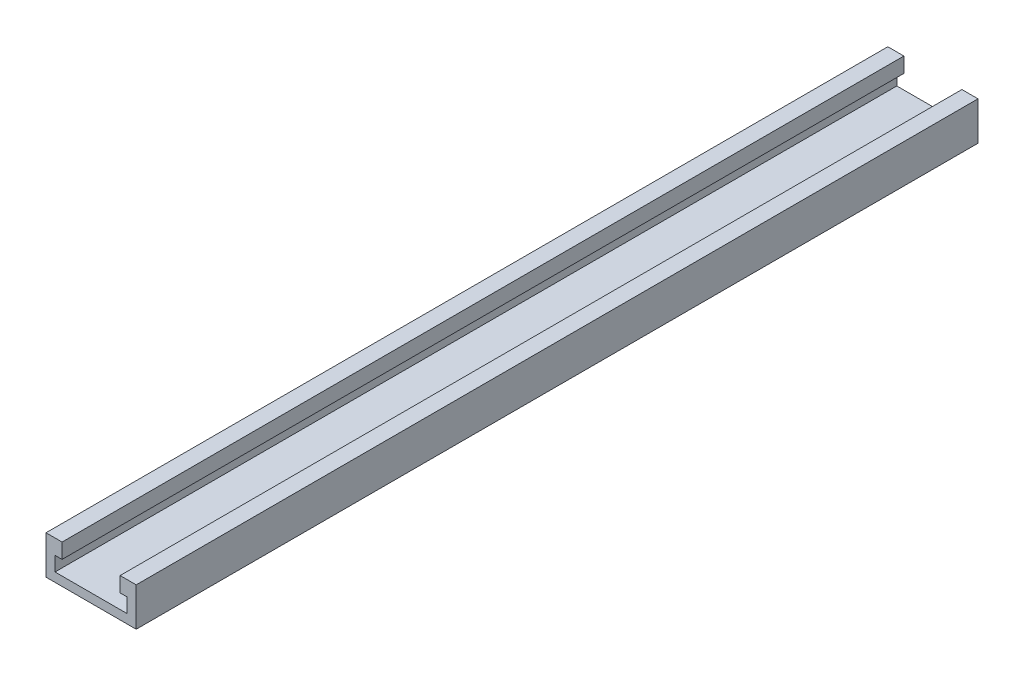
ISO-10303-21;
HEADER;
FILE_DESCRIPTION(('STEP AP214'),'2;1');
FILE_NAME('part.step','',(''),(''),'','','');
FILE_SCHEMA(('AUTOMOTIVE_DESIGN { 1 0 10303 214 1 1 1 1 }'));
ENDSEC;
DATA;
#1=APPLICATION_CONTEXT('core data for automotive mechanical design processes');
#2=APPLICATION_PROTOCOL_DEFINITION('international standard','automotive_design',2000,#1);
#3=PRODUCT_CONTEXT('',#1,'mechanical');
#4=PRODUCT('Part','Part','',(#3));
#5=PRODUCT_RELATED_PRODUCT_CATEGORY('part','',(#4));
#6=PRODUCT_DEFINITION_FORMATION('','',#4);
#7=PRODUCT_DEFINITION_CONTEXT('part definition',#1,'design');
#8=PRODUCT_DEFINITION('design','',#6,#7);
#9=PRODUCT_DEFINITION_SHAPE('','',#8);
#10=(LENGTH_UNIT() NAMED_UNIT(*) SI_UNIT(.MILLI.,.METRE.));
#11=(NAMED_UNIT(*) PLANE_ANGLE_UNIT() SI_UNIT($,.RADIAN.));
#12=(NAMED_UNIT(*) SI_UNIT($,.STERADIAN.) SOLID_ANGLE_UNIT());
#13=UNCERTAINTY_MEASURE_WITH_UNIT(LENGTH_MEASURE(1.E-05),#10,'distance_accuracy_value','');
#14=(GEOMETRIC_REPRESENTATION_CONTEXT(3) GLOBAL_UNCERTAINTY_ASSIGNED_CONTEXT((#13)) GLOBAL_UNIT_ASSIGNED_CONTEXT((#10,
#11,#12)) REPRESENTATION_CONTEXT('',''));
#15=CARTESIAN_POINT('',(0.,0.,0.));
#16=DIRECTION('',(0.,0.,1.));
#17=DIRECTION('',(1.,0.,0.));
#18=AXIS2_PLACEMENT_3D('',#15,#16,#17);
#19=CARTESIAN_POINT('',(15.,0.,280.));
#20=DIRECTION('',(-1.,0.,0.));
#21=DIRECTION('',(0.,0.,1.));
#22=AXIS2_PLACEMENT_3D('',#19,#20,#21);
#23=PLANE('',#22);
#24=DIRECTION('',(0.,1.,0.));
#25=VECTOR('',#24,1.);
#26=CARTESIAN_POINT('',(15.,0.,0.));
#27=LINE('',#26,#25);
#28=CARTESIAN_POINT('',(15.,0.,0.));
#29=VERTEX_POINT('',#28);
#30=CARTESIAN_POINT('',(15.,12.8,0.));
#31=VERTEX_POINT('',#30);
#32=EDGE_CURVE('E153',#29,#31,#27,.T.);
#33=ORIENTED_EDGE('',*,*,#32,.T.);
#34=DIRECTION('',(0.,0.,-1.));
#35=VECTOR('',#34,1.);
#36=CARTESIAN_POINT('',(15.,12.8,280.));
#37=LINE('',#36,#35);
#38=CARTESIAN_POINT('',(15.,12.8,280.));
#39=VERTEX_POINT('',#38);
#40=EDGE_CURVE('E11',#39,#31,#37,.T.);
#41=ORIENTED_EDGE('',*,*,#40,.F.);
#42=DIRECTION('',(0.,1.,0.));
#43=VECTOR('',#42,1.);
#44=CARTESIAN_POINT('',(15.,0.,280.));
#45=LINE('',#44,#43);
#46=CARTESIAN_POINT('',(15.,0.,280.));
#47=VERTEX_POINT('',#46);
#48=EDGE_CURVE('E175',#47,#39,#45,.T.);
#49=ORIENTED_EDGE('',*,*,#48,.F.);
#50=DIRECTION('',(0.,0.,-1.));
#51=VECTOR('',#50,1.);
#52=CARTESIAN_POINT('',(15.,0.,280.));
#53=LINE('',#52,#51);
#54=EDGE_CURVE('E149',#47,#29,#53,.T.);
#55=ORIENTED_EDGE('',*,*,#54,.T.);
#56=EDGE_LOOP('',(#33,#41,#49,#55));
#57=FACE_BOUND('',#56,.T.);
#58=ADVANCED_FACE('F33',(#57),#23,.F.);
#59=CARTESIAN_POINT('',(15.,12.8,280.));
#60=DIRECTION('',(0.,-1.,0.));
#61=DIRECTION('',(0.,0.,-1.));
#62=AXIS2_PLACEMENT_3D('',#59,#60,#61);
#63=PLANE('',#62);
#64=DIRECTION('',(-1.,0.,0.));
#65=VECTOR('',#64,1.);
#66=CARTESIAN_POINT('',(15.,12.8,0.));
#67=LINE('',#66,#65);
#68=CARTESIAN_POINT('',(9.65,12.8,0.));
#69=VERTEX_POINT('',#68);
#70=EDGE_CURVE('E156',#31,#69,#67,.T.);
#71=ORIENTED_EDGE('',*,*,#70,.T.);
#72=DIRECTION('',(0.,0.,-1.));
#73=VECTOR('',#72,1.);
#74=CARTESIAN_POINT('',(9.65,12.8,280.));
#75=LINE('',#74,#73);
#76=CARTESIAN_POINT('',(9.65,12.8,280.));
#77=VERTEX_POINT('',#76);
#78=EDGE_CURVE('E41',#77,#69,#75,.T.);
#79=ORIENTED_EDGE('',*,*,#78,.F.);
#80=DIRECTION('',(-1.,0.,0.));
#81=VECTOR('',#80,1.);
#82=CARTESIAN_POINT('',(15.,12.8,280.));
#83=LINE('',#82,#81);
#84=EDGE_CURVE('E104',#39,#77,#83,.T.);
#85=ORIENTED_EDGE('',*,*,#84,.F.);
#86=ORIENTED_EDGE('',*,*,#40,.T.);
#87=EDGE_LOOP('',(#71,#79,#85,#86));
#88=FACE_BOUND('',#87,.T.);
#89=ADVANCED_FACE('F253',(#88),#63,.F.);
#90=CARTESIAN_POINT('',(9.65,12.8,280.));
#91=DIRECTION('',(1.,0.,0.));
#92=DIRECTION('',(0.,0.,-1.));
#93=AXIS2_PLACEMENT_3D('',#90,#91,#92);
#94=PLANE('',#93);
#95=DIRECTION('',(0.,-1.,0.));
#96=VECTOR('',#95,1.);
#97=CARTESIAN_POINT('',(9.65,12.8,0.));
#98=LINE('',#97,#96);
#99=CARTESIAN_POINT('',(9.65,7.8,0.));
#100=VERTEX_POINT('',#99);
#101=EDGE_CURVE('E158',#69,#100,#98,.T.);
#102=ORIENTED_EDGE('',*,*,#101,.T.);
#103=DIRECTION('',(0.,0.,-1.));
#104=VECTOR('',#103,1.);
#105=CARTESIAN_POINT('',(9.65,7.8,280.));
#106=LINE('',#105,#104);
#107=CARTESIAN_POINT('',(9.65,7.8,280.));
#108=VERTEX_POINT('',#107);
#109=EDGE_CURVE('E194',#108,#100,#106,.T.);
#110=ORIENTED_EDGE('',*,*,#109,.F.);
#111=DIRECTION('',(0.,-1.,0.));
#112=VECTOR('',#111,1.);
#113=CARTESIAN_POINT('',(9.65,12.8,280.));
#114=LINE('',#113,#112);
#115=EDGE_CURVE('E202',#77,#108,#114,.T.);
#116=ORIENTED_EDGE('',*,*,#115,.F.);
#117=ORIENTED_EDGE('',*,*,#78,.T.);
#118=EDGE_LOOP('',(#102,#110,#116,#117));
#119=FACE_BOUND('',#118,.T.);
#120=ADVANCED_FACE('F200',(#119),#94,.F.);
#121=CARTESIAN_POINT('',(9.65,7.8,280.));
#122=DIRECTION('',(0.,1.,0.));
#123=DIRECTION('',(0.,0.,1.));
#124=AXIS2_PLACEMENT_3D('',#121,#122,#123);
#125=PLANE('',#124);
#126=DIRECTION('',(1.,0.,0.));
#127=VECTOR('',#126,1.);
#128=CARTESIAN_POINT('',(9.65,7.8,0.));
#129=LINE('',#128,#127);
#130=CARTESIAN_POINT('',(12.,7.8,0.));
#131=VERTEX_POINT('',#130);
#132=EDGE_CURVE('E160',#100,#131,#129,.T.);
#133=ORIENTED_EDGE('',*,*,#132,.T.);
#134=DIRECTION('',(0.,0.,-1.));
#135=VECTOR('',#134,1.);
#136=CARTESIAN_POINT('',(12.,7.8,280.));
#137=LINE('',#136,#135);
#138=CARTESIAN_POINT('',(12.,7.8,280.));
#139=VERTEX_POINT('',#138);
#140=EDGE_CURVE('E191',#139,#131,#137,.T.);
#141=ORIENTED_EDGE('',*,*,#140,.F.);
#142=DIRECTION('',(1.,0.,0.));
#143=VECTOR('',#142,1.);
#144=CARTESIAN_POINT('',(9.65,7.8,280.));
#145=LINE('',#144,#143);
#146=EDGE_CURVE('E220',#108,#139,#145,.T.);
#147=ORIENTED_EDGE('',*,*,#146,.F.);
#148=ORIENTED_EDGE('',*,*,#109,.T.);
#149=EDGE_LOOP('',(#133,#141,#147,#148));
#150=FACE_BOUND('',#149,.T.);
#151=ADVANCED_FACE('F211',(#150),#125,.F.);
#152=CARTESIAN_POINT('',(12.,7.8,280.));
#153=DIRECTION('',(1.,0.,0.));
#154=DIRECTION('',(0.,0.,-1.));
#155=AXIS2_PLACEMENT_3D('',#152,#153,#154);
#156=PLANE('',#155);
#157=DIRECTION('',(0.,-1.,0.));
#158=VECTOR('',#157,1.);
#159=CARTESIAN_POINT('',(12.,7.8,0.));
#160=LINE('',#159,#158);
#161=CARTESIAN_POINT('',(12.,3.,0.));
#162=VERTEX_POINT('',#161);
#163=EDGE_CURVE('E162',#131,#162,#160,.T.);
#164=ORIENTED_EDGE('',*,*,#163,.T.);
#165=DIRECTION('',(0.,0.,-1.));
#166=VECTOR('',#165,1.);
#167=CARTESIAN_POINT('',(12.,3.,280.));
#168=LINE('',#167,#166);
#169=CARTESIAN_POINT('',(12.,3.,280.));
#170=VERTEX_POINT('',#169);
#171=EDGE_CURVE('E188',#170,#162,#168,.T.);
#172=ORIENTED_EDGE('',*,*,#171,.F.);
#173=DIRECTION('',(0.,-1.,0.));
#174=VECTOR('',#173,1.);
#175=CARTESIAN_POINT('',(12.,7.8,280.));
#176=LINE('',#175,#174);
#177=EDGE_CURVE('E217',#139,#170,#176,.T.);
#178=ORIENTED_EDGE('',*,*,#177,.F.);
#179=ORIENTED_EDGE('',*,*,#140,.T.);
#180=EDGE_LOOP('',(#164,#172,#178,#179));
#181=FACE_BOUND('',#180,.T.);
#182=ADVANCED_FACE('F215',(#181),#156,.F.);
#183=CARTESIAN_POINT('',(12.,3.,280.));
#184=DIRECTION('',(0.,-1.,0.));
#185=DIRECTION('',(0.,0.,-1.));
#186=AXIS2_PLACEMENT_3D('',#183,#184,#185);
#187=PLANE('',#186);
#188=DIRECTION('',(-1.,0.,0.));
#189=VECTOR('',#188,1.);
#190=CARTESIAN_POINT('',(12.,3.,0.));
#191=LINE('',#190,#189);
#192=CARTESIAN_POINT('',(-12.,3.,0.));
#193=VERTEX_POINT('',#192);
#194=EDGE_CURVE('E164',#162,#193,#191,.T.);
#195=ORIENTED_EDGE('',*,*,#194,.T.);
#196=DIRECTION('',(0.,0.,-1.));
#197=VECTOR('',#196,1.);
#198=CARTESIAN_POINT('',(-12.,3.,280.));
#199=LINE('',#198,#197);
#200=CARTESIAN_POINT('',(-12.,3.,280.));
#201=VERTEX_POINT('',#200);
#202=EDGE_CURVE('E185',#201,#193,#199,.T.);
#203=ORIENTED_EDGE('',*,*,#202,.F.);
#204=DIRECTION('',(-1.,0.,0.));
#205=VECTOR('',#204,1.);
#206=CARTESIAN_POINT('',(12.,3.,280.));
#207=LINE('',#206,#205);
#208=EDGE_CURVE('E219',#170,#201,#207,.T.);
#209=ORIENTED_EDGE('',*,*,#208,.F.);
#210=ORIENTED_EDGE('',*,*,#171,.T.);
#211=EDGE_LOOP('',(#195,#203,#209,#210));
#212=FACE_BOUND('',#211,.T.);
#213=ADVANCED_FACE('F266',(#212),#187,.F.);
#214=CARTESIAN_POINT('',(-12.,7.8,280.));
#215=DIRECTION('',(-1.,0.,0.));
#216=DIRECTION('',(0.,0.,1.));
#217=AXIS2_PLACEMENT_3D('',#214,#215,#216);
#218=PLANE('',#217);
#219=DIRECTION('',(0.,1.,0.));
#220=VECTOR('',#219,1.);
#221=CARTESIAN_POINT('',(-12.,7.8,0.));
#222=LINE('',#221,#220);
#223=CARTESIAN_POINT('',(-12.,7.8,0.));
#224=VERTEX_POINT('',#223);
#225=EDGE_CURVE('E166',#193,#224,#222,.T.);
#226=ORIENTED_EDGE('',*,*,#225,.T.);
#227=DIRECTION('',(0.,0.,-1.));
#228=VECTOR('',#227,1.);
#229=CARTESIAN_POINT('',(-12.,7.8,280.));
#230=LINE('',#229,#228);
#231=CARTESIAN_POINT('',(-12.,7.8,280.));
#232=VERTEX_POINT('',#231);
#233=EDGE_CURVE('E182',#232,#224,#230,.T.);
#234=ORIENTED_EDGE('',*,*,#233,.F.);
#235=DIRECTION('',(0.,1.,0.));
#236=VECTOR('',#235,1.);
#237=CARTESIAN_POINT('',(-12.,7.8,280.));
#238=LINE('',#237,#236);
#239=EDGE_CURVE('E222',#201,#232,#238,.T.);
#240=ORIENTED_EDGE('',*,*,#239,.F.);
#241=ORIENTED_EDGE('',*,*,#202,.T.);
#242=EDGE_LOOP('',(#226,#234,#240,#241));
#243=FACE_BOUND('',#242,.T.);
#244=ADVANCED_FACE('F269',(#243),#218,.F.);
#245=CARTESIAN_POINT('',(-9.65,7.8,280.));
#246=DIRECTION('',(0.,1.,0.));
#247=DIRECTION('',(0.,0.,1.));
#248=AXIS2_PLACEMENT_3D('',#245,#246,#247);
#249=PLANE('',#248);
#250=DIRECTION('',(1.,0.,0.));
#251=VECTOR('',#250,1.);
#252=CARTESIAN_POINT('',(-9.65,7.8,0.));
#253=LINE('',#252,#251);
#254=CARTESIAN_POINT('',(-9.65,7.8,0.));
#255=VERTEX_POINT('',#254);
#256=EDGE_CURVE('E168',#224,#255,#253,.T.);
#257=ORIENTED_EDGE('',*,*,#256,.T.);
#258=DIRECTION('',(0.,0.,-1.));
#259=VECTOR('',#258,1.);
#260=CARTESIAN_POINT('',(-9.65,7.8,280.));
#261=LINE('',#260,#259);
#262=CARTESIAN_POINT('',(-9.65,7.8,280.));
#263=VERTEX_POINT('',#262);
#264=EDGE_CURVE('E179',#263,#255,#261,.T.);
#265=ORIENTED_EDGE('',*,*,#264,.F.);
#266=DIRECTION('',(1.,0.,0.));
#267=VECTOR('',#266,1.);
#268=CARTESIAN_POINT('',(-9.65,7.8,280.));
#269=LINE('',#268,#267);
#270=EDGE_CURVE('E228',#232,#263,#269,.T.);
#271=ORIENTED_EDGE('',*,*,#270,.F.);
#272=ORIENTED_EDGE('',*,*,#233,.T.);
#273=EDGE_LOOP('',(#257,#265,#271,#272));
#274=FACE_BOUND('',#273,.T.);
#275=ADVANCED_FACE('F234',(#274),#249,.F.);
#276=CARTESIAN_POINT('',(-9.65,12.8,280.));
#277=DIRECTION('',(-1.,0.,0.));
#278=DIRECTION('',(0.,0.,1.));
#279=AXIS2_PLACEMENT_3D('',#276,#277,#278);
#280=PLANE('',#279);
#281=DIRECTION('',(0.,1.,0.));
#282=VECTOR('',#281,1.);
#283=CARTESIAN_POINT('',(-9.65,12.8,0.));
#284=LINE('',#283,#282);
#285=CARTESIAN_POINT('',(-9.65,12.8,0.));
#286=VERTEX_POINT('',#285);
#287=EDGE_CURVE('E170',#255,#286,#284,.T.);
#288=ORIENTED_EDGE('',*,*,#287,.T.);
#289=DIRECTION('',(0.,0.,-1.));
#290=VECTOR('',#289,1.);
#291=CARTESIAN_POINT('',(-9.65,12.8,280.));
#292=LINE('',#291,#290);
#293=CARTESIAN_POINT('',(-9.65,12.8,280.));
#294=VERTEX_POINT('',#293);
#295=EDGE_CURVE('E144',#294,#286,#292,.T.);
#296=ORIENTED_EDGE('',*,*,#295,.F.);
#297=DIRECTION('',(0.,1.,0.));
#298=VECTOR('',#297,1.);
#299=CARTESIAN_POINT('',(-9.65,12.8,280.));
#300=LINE('',#299,#298);
#301=EDGE_CURVE('E135',#263,#294,#300,.T.);
#302=ORIENTED_EDGE('',*,*,#301,.F.);
#303=ORIENTED_EDGE('',*,*,#264,.T.);
#304=EDGE_LOOP('',(#288,#296,#302,#303));
#305=FACE_BOUND('',#304,.T.);
#306=ADVANCED_FACE('F238',(#305),#280,.F.);
#307=CARTESIAN_POINT('',(-15.,12.8,280.));
#308=DIRECTION('',(0.,-1.,0.));
#309=DIRECTION('',(0.,0.,-1.));
#310=AXIS2_PLACEMENT_3D('',#307,#308,#309);
#311=PLANE('',#310);
#312=DIRECTION('',(-1.,0.,0.));
#313=VECTOR('',#312,1.);
#314=CARTESIAN_POINT('',(-15.,12.8,0.));
#315=LINE('',#314,#313);
#316=CARTESIAN_POINT('',(-15.,12.8,0.));
#317=VERTEX_POINT('',#316);
#318=EDGE_CURVE('E143',#286,#317,#315,.T.);
#319=ORIENTED_EDGE('',*,*,#318,.T.);
#320=DIRECTION('',(0.,0.,-1.));
#321=VECTOR('',#320,1.);
#322=CARTESIAN_POINT('',(-15.,12.8,280.));
#323=LINE('',#322,#321);
#324=CARTESIAN_POINT('',(-15.,12.8,280.));
#325=VERTEX_POINT('',#324);
#326=EDGE_CURVE('E140',#325,#317,#323,.T.);
#327=ORIENTED_EDGE('',*,*,#326,.F.);
#328=DIRECTION('',(-1.,0.,0.));
#329=VECTOR('',#328,1.);
#330=CARTESIAN_POINT('',(-15.,12.8,280.));
#331=LINE('',#330,#329);
#332=EDGE_CURVE('E129',#294,#325,#331,.T.);
#333=ORIENTED_EDGE('',*,*,#332,.F.);
#334=ORIENTED_EDGE('',*,*,#295,.T.);
#335=EDGE_LOOP('',(#319,#327,#333,#334));
#336=FACE_BOUND('',#335,.T.);
#337=ADVANCED_FACE('F141',(#336),#311,.F.);
#338=CARTESIAN_POINT('',(-15.,0.,280.));
#339=DIRECTION('',(1.,0.,0.));
#340=DIRECTION('',(0.,0.,-1.));
#341=AXIS2_PLACEMENT_3D('',#338,#339,#340);
#342=PLANE('',#341);
#343=DIRECTION('',(0.,-1.,0.));
#344=VECTOR('',#343,1.);
#345=CARTESIAN_POINT('',(-15.,0.,0.));
#346=LINE('',#345,#344);
#347=CARTESIAN_POINT('',(-15.,0.,0.));
#348=VERTEX_POINT('',#347);
#349=EDGE_CURVE('E90',#317,#348,#346,.T.);
#350=ORIENTED_EDGE('',*,*,#349,.T.);
#351=DIRECTION('',(0.,0.,-1.));
#352=VECTOR('',#351,1.);
#353=CARTESIAN_POINT('',(-15.,0.,280.));
#354=LINE('',#353,#352);
#355=CARTESIAN_POINT('',(-15.,0.,280.));
#356=VERTEX_POINT('',#355);
#357=EDGE_CURVE('E145',#356,#348,#354,.T.);
#358=ORIENTED_EDGE('',*,*,#357,.F.);
#359=DIRECTION('',(0.,-1.,0.));
#360=VECTOR('',#359,1.);
#361=CARTESIAN_POINT('',(-15.,0.,280.));
#362=LINE('',#361,#360);
#363=EDGE_CURVE('E133',#325,#356,#362,.T.);
#364=ORIENTED_EDGE('',*,*,#363,.F.);
#365=ORIENTED_EDGE('',*,*,#326,.T.);
#366=EDGE_LOOP('',(#350,#358,#364,#365));
#367=FACE_BOUND('',#366,.T.);
#368=ADVANCED_FACE('F147',(#367),#342,.F.);
#369=CARTESIAN_POINT('',(-15.,0.,280.));
#370=DIRECTION('',(0.,1.,0.));
#371=DIRECTION('',(0.,0.,1.));
#372=AXIS2_PLACEMENT_3D('',#369,#370,#371);
#373=PLANE('',#372);
#374=DIRECTION('',(1.,0.,0.));
#375=VECTOR('',#374,1.);
#376=CARTESIAN_POINT('',(-15.,0.,0.));
#377=LINE('',#376,#375);
#378=EDGE_CURVE('E96',#348,#29,#377,.T.);
#379=ORIENTED_EDGE('',*,*,#378,.T.);
#380=ORIENTED_EDGE('',*,*,#54,.F.);
#381=DIRECTION('',(1.,0.,0.));
#382=VECTOR('',#381,1.);
#383=CARTESIAN_POINT('',(-15.,0.,280.));
#384=LINE('',#383,#382);
#385=EDGE_CURVE('E49',#356,#47,#384,.T.);
#386=ORIENTED_EDGE('',*,*,#385,.F.);
#387=ORIENTED_EDGE('',*,*,#357,.T.);
#388=EDGE_LOOP('',(#379,#380,#386,#387));
#389=FACE_BOUND('',#388,.T.);
#390=ADVANCED_FACE('F242',(#389),#373,.F.);
#391=CARTESIAN_POINT('',(0.,0.,280.));
#392=DIRECTION('',(0.,0.,1.));
#393=DIRECTION('',(1.,0.,0.));
#394=AXIS2_PLACEMENT_3D('',#391,#392,#393);
#395=PLANE('',#394);
#396=ORIENTED_EDGE('',*,*,#48,.T.);
#397=ORIENTED_EDGE('',*,*,#84,.T.);
#398=ORIENTED_EDGE('',*,*,#115,.T.);
#399=ORIENTED_EDGE('',*,*,#146,.T.);
#400=ORIENTED_EDGE('',*,*,#177,.T.);
#401=ORIENTED_EDGE('',*,*,#208,.T.);
#402=ORIENTED_EDGE('',*,*,#239,.T.);
#403=ORIENTED_EDGE('',*,*,#270,.T.);
#404=ORIENTED_EDGE('',*,*,#301,.T.);
#405=ORIENTED_EDGE('',*,*,#332,.T.);
#406=ORIENTED_EDGE('',*,*,#363,.T.);
#407=ORIENTED_EDGE('',*,*,#385,.T.);
#408=EDGE_LOOP('',(#396,#397,#398,#399,#400,#401,#402,#403,#404,#405,#406,#407));
#409=FACE_BOUND('',#408,.T.);
#410=ADVANCED_FACE('F131',(#409),#395,.T.);
#411=CARTESIAN_POINT('',(0.,0.,0.));
#412=DIRECTION('',(0.,0.,1.));
#413=DIRECTION('',(1.,0.,0.));
#414=AXIS2_PLACEMENT_3D('',#411,#412,#413);
#415=PLANE('',#414);
#416=ORIENTED_EDGE('',*,*,#32,.F.);
#417=ORIENTED_EDGE('',*,*,#378,.F.);
#418=ORIENTED_EDGE('',*,*,#349,.F.);
#419=ORIENTED_EDGE('',*,*,#318,.F.);
#420=ORIENTED_EDGE('',*,*,#287,.F.);
#421=ORIENTED_EDGE('',*,*,#256,.F.);
#422=ORIENTED_EDGE('',*,*,#225,.F.);
#423=ORIENTED_EDGE('',*,*,#194,.F.);
#424=ORIENTED_EDGE('',*,*,#163,.F.);
#425=ORIENTED_EDGE('',*,*,#132,.F.);
#426=ORIENTED_EDGE('',*,*,#101,.F.);
#427=ORIENTED_EDGE('',*,*,#70,.F.);
#428=EDGE_LOOP('',(#416,#417,#418,#419,#420,#421,#422,#423,#424,#425,#426,#427));
#429=FACE_BOUND('',#428,.T.);
#430=ADVANCED_FACE('F206',(#429),#415,.F.);
#431=CLOSED_SHELL('',(#58,#89,#120,#151,#182,#213,#244,#275,#306,#337,#368,#390,#410,#430));
#432=MANIFOLD_SOLID_BREP('B2',#431);
#433=ADVANCED_BREP_SHAPE_REPRESENTATION('',(#18,#432),#14);
#434=SHAPE_DEFINITION_REPRESENTATION(#9,#433);
ENDSEC;
END-ISO-10303-21;
